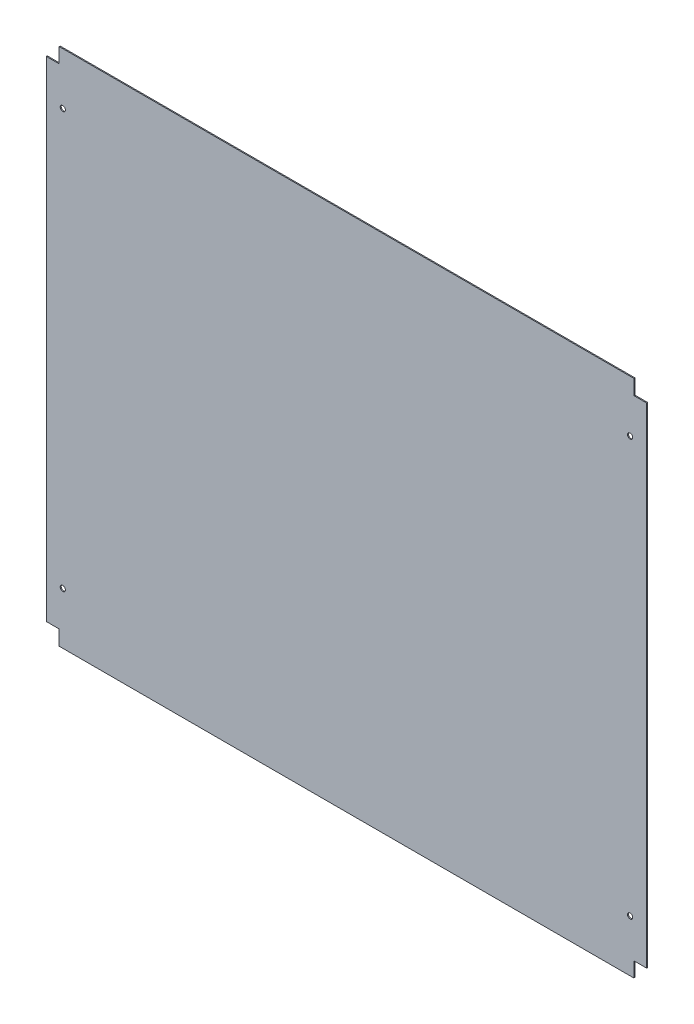
ISO-10303-21;
HEADER;
FILE_DESCRIPTION(('STEP AP214'),'2;1');
FILE_NAME('part.step','',(''),(''),'','','');
FILE_SCHEMA(('AUTOMOTIVE_DESIGN { 1 0 10303 214 1 1 1 1 }'));
ENDSEC;
DATA;
#1=APPLICATION_CONTEXT('core data for automotive mechanical design processes');
#2=APPLICATION_PROTOCOL_DEFINITION('international standard','automotive_design',2000,#1);
#3=PRODUCT_CONTEXT('',#1,'mechanical');
#4=PRODUCT('Part','Part','',(#3));
#5=PRODUCT_RELATED_PRODUCT_CATEGORY('part','',(#4));
#6=PRODUCT_DEFINITION_FORMATION('','',#4);
#7=PRODUCT_DEFINITION_CONTEXT('part definition',#1,'design');
#8=PRODUCT_DEFINITION('design','',#6,#7);
#9=PRODUCT_DEFINITION_SHAPE('','',#8);
#10=(LENGTH_UNIT() NAMED_UNIT(*) SI_UNIT(.MILLI.,.METRE.));
#11=(NAMED_UNIT(*) PLANE_ANGLE_UNIT() SI_UNIT($,.RADIAN.));
#12=(NAMED_UNIT(*) SI_UNIT($,.STERADIAN.) SOLID_ANGLE_UNIT());
#13=UNCERTAINTY_MEASURE_WITH_UNIT(LENGTH_MEASURE(1.E-05),#10,'distance_accuracy_value','');
#14=(GEOMETRIC_REPRESENTATION_CONTEXT(3) GLOBAL_UNCERTAINTY_ASSIGNED_CONTEXT((#13)) GLOBAL_UNIT_ASSIGNED_CONTEXT((#10,
#11,#12)) REPRESENTATION_CONTEXT('',''));
#15=CARTESIAN_POINT('',(0.,0.,0.));
#16=DIRECTION('',(0.,0.,1.));
#17=DIRECTION('',(1.,0.,0.));
#18=AXIS2_PLACEMENT_3D('',#15,#16,#17);
#19=CARTESIAN_POINT('',(442.087,-373.888,-19.05));
#20=DIRECTION('',(0.,1.,0.));
#21=DIRECTION('',(0.,0.,1.));
#22=AXIS2_PLACEMENT_3D('',#19,#20,#21);
#23=PLANE('',#22);
#24=DIRECTION('',(1.,0.,0.));
#25=VECTOR('',#24,1.);
#26=CARTESIAN_POINT('',(0.,-373.888,-1.524));
#27=LINE('',#26,#25);
#28=CARTESIAN_POINT('',(438.9628,-373.888,-1.524));
#29=VERTEX_POINT('',#28);
#30=CARTESIAN_POINT('',(458.583962531013,-373.888,-1.52399999999986));
#31=VERTEX_POINT('',#30);
#32=EDGE_CURVE('E351',#29,#31,#27,.T.);
#33=ORIENTED_EDGE('',*,*,#32,.T.);
#34=DIRECTION('',(0.,0.,-1.));
#35=VECTOR('',#34,1.);
#36=CARTESIAN_POINT('',(458.583962531013,-373.888,2.22044604925031E-13));
#37=LINE('',#36,#35);
#38=CARTESIAN_POINT('',(458.583962531013,-373.888,2.22044604925031E-13));
#39=VERTEX_POINT('',#38);
#40=EDGE_CURVE('E271',#39,#31,#37,.T.);
#41=ORIENTED_EDGE('',*,*,#40,.F.);
#42=DIRECTION('',(-1.,0.,0.));
#43=VECTOR('',#42,1.);
#44=CARTESIAN_POINT('',(442.087,-373.888,0.));
#45=LINE('',#44,#43);
#46=CARTESIAN_POINT('',(438.9628,-373.888,0.));
#47=VERTEX_POINT('',#46);
#48=EDGE_CURVE('E298',#39,#47,#45,.T.);
#49=ORIENTED_EDGE('',*,*,#48,.T.);
#50=DIRECTION('',(0.,0.,1.));
#51=VECTOR('',#50,1.);
#52=CARTESIAN_POINT('',(438.9628,-373.888,-19.05));
#53=LINE('',#52,#51);
#54=EDGE_CURVE('E324',#29,#47,#53,.T.);
#55=ORIENTED_EDGE('',*,*,#54,.F.);
#56=EDGE_LOOP('',(#33,#41,#49,#55));
#57=FACE_BOUND('',#56,.T.);
#58=ADVANCED_FACE('F136',(#57),#23,.F.);
#59=CARTESIAN_POINT('',(438.9628,-380.238,-19.05));
#60=DIRECTION('',(-1.,0.,0.));
#61=DIRECTION('',(0.,0.,1.));
#62=AXIS2_PLACEMENT_3D('',#59,#60,#61);
#63=PLANE('',#62);
#64=DIRECTION('',(0.,-1.,0.));
#65=VECTOR('',#64,1.);
#66=CARTESIAN_POINT('',(438.9628,-380.238,0.));
#67=LINE('',#66,#65);
#68=CARTESIAN_POINT('',(438.9628,-396.734962531013,1.11022302462516E-13));
#69=VERTEX_POINT('',#68);
#70=EDGE_CURVE('E333',#47,#69,#67,.T.);
#71=ORIENTED_EDGE('',*,*,#70,.T.);
#72=DIRECTION('',(0.,0.,1.));
#73=VECTOR('',#72,1.);
#74=CARTESIAN_POINT('',(438.9628,-396.734962531013,1.11022302462516E-13));
#75=LINE('',#74,#73);
#76=CARTESIAN_POINT('',(438.9628,-396.734962531013,-1.52399999999986));
#77=VERTEX_POINT('',#76);
#78=EDGE_CURVE('E260',#77,#69,#75,.T.);
#79=ORIENTED_EDGE('',*,*,#78,.F.);
#80=DIRECTION('',(0.,1.,0.));
#81=VECTOR('',#80,1.);
#82=CARTESIAN_POINT('',(438.9628,0.,-1.524));
#83=LINE('',#82,#81);
#84=EDGE_CURVE('E152',#77,#29,#83,.T.);
#85=ORIENTED_EDGE('',*,*,#84,.T.);
#86=ORIENTED_EDGE('',*,*,#54,.T.);
#87=EDGE_LOOP('',(#71,#79,#85,#86));
#88=FACE_BOUND('',#87,.T.);
#89=ADVANCED_FACE('F434',(#88),#63,.F.);
#90=CARTESIAN_POINT('',(438.9628,380.238,-19.05));
#91=DIRECTION('',(-1.,0.,0.));
#92=DIRECTION('',(0.,0.,1.));
#93=AXIS2_PLACEMENT_3D('',#90,#91,#92);
#94=PLANE('',#93);
#95=DIRECTION('',(0.,1.,0.));
#96=VECTOR('',#95,1.);
#97=CARTESIAN_POINT('',(438.9628,0.,-1.524));
#98=LINE('',#97,#96);
#99=CARTESIAN_POINT('',(438.9628,373.888,-1.524));
#100=VERTEX_POINT('',#99);
#101=CARTESIAN_POINT('',(438.9628,396.734962531012,-1.52399999999991));
#102=VERTEX_POINT('',#101);
#103=EDGE_CURVE('E242',#100,#102,#98,.T.);
#104=ORIENTED_EDGE('',*,*,#103,.T.);
#105=DIRECTION('',(0.,0.,-1.));
#106=VECTOR('',#105,1.);
#107=CARTESIAN_POINT('',(438.9628,396.734962531012,1.11022302462516E-13));
#108=LINE('',#107,#106);
#109=CARTESIAN_POINT('',(438.9628,396.734962531012,1.11022302462516E-13));
#110=VERTEX_POINT('',#109);
#111=EDGE_CURVE('E239',#110,#102,#108,.T.);
#112=ORIENTED_EDGE('',*,*,#111,.F.);
#113=DIRECTION('',(0.,-1.,0.));
#114=VECTOR('',#113,1.);
#115=CARTESIAN_POINT('',(438.9628,380.238,0.));
#116=LINE('',#115,#114);
#117=CARTESIAN_POINT('',(438.9628,373.888,0.));
#118=VERTEX_POINT('',#117);
#119=EDGE_CURVE('E227',#110,#118,#116,.T.);
#120=ORIENTED_EDGE('',*,*,#119,.T.);
#121=DIRECTION('',(0.,0.,1.));
#122=VECTOR('',#121,1.);
#123=CARTESIAN_POINT('',(438.9628,373.888,-19.05));
#124=LINE('',#123,#122);
#125=EDGE_CURVE('E340',#100,#118,#124,.T.);
#126=ORIENTED_EDGE('',*,*,#125,.F.);
#127=EDGE_LOOP('',(#104,#112,#120,#126));
#128=FACE_BOUND('',#127,.T.);
#129=ADVANCED_FACE('F240',(#128),#94,.F.);
#130=CARTESIAN_POINT('',(442.087,373.888,-19.05));
#131=DIRECTION('',(0.,-1.,0.));
#132=DIRECTION('',(1.,0.,0.));
#133=AXIS2_PLACEMENT_3D('',#130,#131,#132);
#134=PLANE('',#133);
#135=DIRECTION('',(1.,0.,0.));
#136=VECTOR('',#135,1.);
#137=CARTESIAN_POINT('',(442.087,373.888,0.));
#138=LINE('',#137,#136);
#139=CARTESIAN_POINT('',(458.583962531013,373.888,1.66533453693773E-13));
#140=VERTEX_POINT('',#139);
#141=EDGE_CURVE('E233',#118,#140,#138,.T.);
#142=ORIENTED_EDGE('',*,*,#141,.T.);
#143=DIRECTION('',(0.,0.,1.));
#144=VECTOR('',#143,1.);
#145=CARTESIAN_POINT('',(458.583962531013,373.888,0.));
#146=LINE('',#145,#144);
#147=CARTESIAN_POINT('',(458.583962531013,373.888,-1.52399999999986));
#148=VERTEX_POINT('',#147);
#149=EDGE_CURVE('E283',#148,#140,#146,.T.);
#150=ORIENTED_EDGE('',*,*,#149,.F.);
#151=DIRECTION('',(-1.,0.,0.));
#152=VECTOR('',#151,1.);
#153=CARTESIAN_POINT('',(1.32865714816934E-11,373.888000000016,-1.524));
#154=LINE('',#153,#152);
#155=EDGE_CURVE('E160',#148,#100,#154,.T.);
#156=ORIENTED_EDGE('',*,*,#155,.T.);
#157=ORIENTED_EDGE('',*,*,#125,.T.);
#158=EDGE_LOOP('',(#142,#150,#156,#157));
#159=FACE_BOUND('',#158,.T.);
#160=ADVANCED_FACE('F442',(#159),#134,.F.);
#161=CARTESIAN_POINT('',(-438.9628,-380.238,-19.05));
#162=DIRECTION('',(1.,0.,0.));
#163=DIRECTION('',(0.,0.,-1.));
#164=AXIS2_PLACEMENT_3D('',#161,#162,#163);
#165=PLANE('',#164);
#166=DIRECTION('',(0.,-1.,0.));
#167=VECTOR('',#166,1.);
#168=CARTESIAN_POINT('',(-438.9628,0.,-1.524));
#169=LINE('',#168,#167);
#170=CARTESIAN_POINT('',(-438.9628,-373.888,-1.524));
#171=VERTEX_POINT('',#170);
#172=CARTESIAN_POINT('',(-438.9628,-396.734962531013,-1.52399999999986));
#173=VERTEX_POINT('',#172);
#174=EDGE_CURVE('E354',#171,#173,#169,.T.);
#175=ORIENTED_EDGE('',*,*,#174,.T.);
#176=DIRECTION('',(0.,0.,-1.));
#177=VECTOR('',#176,1.);
#178=CARTESIAN_POINT('',(-438.9628,-396.734962531013,1.11022302462516E-13));
#179=LINE('',#178,#177);
#180=CARTESIAN_POINT('',(-438.9628,-396.734962531013,1.11022302462516E-13));
#181=VERTEX_POINT('',#180);
#182=EDGE_CURVE('E272',#181,#173,#179,.T.);
#183=ORIENTED_EDGE('',*,*,#182,.F.);
#184=DIRECTION('',(0.,1.,0.));
#185=VECTOR('',#184,1.);
#186=CARTESIAN_POINT('',(-438.9628,-380.238,0.));
#187=LINE('',#186,#185);
#188=CARTESIAN_POINT('',(-438.9628,-373.888,0.));
#189=VERTEX_POINT('',#188);
#190=EDGE_CURVE('E320',#181,#189,#187,.T.);
#191=ORIENTED_EDGE('',*,*,#190,.T.);
#192=DIRECTION('',(0.,0.,1.));
#193=VECTOR('',#192,1.);
#194=CARTESIAN_POINT('',(-438.9628,-373.888,-19.05));
#195=LINE('',#194,#193);
#196=EDGE_CURVE('E315',#171,#189,#195,.T.);
#197=ORIENTED_EDGE('',*,*,#196,.F.);
#198=EDGE_LOOP('',(#175,#183,#191,#197));
#199=FACE_BOUND('',#198,.T.);
#200=ADVANCED_FACE('F445',(#199),#165,.F.);
#201=CARTESIAN_POINT('',(-442.087,-373.888,-19.05));
#202=DIRECTION('',(0.,1.,0.));
#203=DIRECTION('',(0.,0.,1.));
#204=AXIS2_PLACEMENT_3D('',#201,#202,#203);
#205=PLANE('',#204);
#206=DIRECTION('',(-1.,0.,0.));
#207=VECTOR('',#206,1.);
#208=CARTESIAN_POINT('',(-442.087,-373.888,0.));
#209=LINE('',#208,#207);
#210=CARTESIAN_POINT('',(-458.583962531012,-373.888,1.66533453693773E-13));
#211=VERTEX_POINT('',#210);
#212=EDGE_CURVE('E323',#189,#211,#209,.T.);
#213=ORIENTED_EDGE('',*,*,#212,.T.);
#214=DIRECTION('',(0.,0.,1.));
#215=VECTOR('',#214,1.);
#216=CARTESIAN_POINT('',(-458.583962531012,-373.888,1.66533453693773E-13));
#217=LINE('',#216,#215);
#218=CARTESIAN_POINT('',(-458.583962531012,-373.888,-1.52399999999986));
#219=VERTEX_POINT('',#218);
#220=EDGE_CURVE('E303',#219,#211,#217,.T.);
#221=ORIENTED_EDGE('',*,*,#220,.F.);
#222=DIRECTION('',(1.,0.,0.));
#223=VECTOR('',#222,1.);
#224=CARTESIAN_POINT('',(0.,-373.888,-1.524));
#225=LINE('',#224,#223);
#226=EDGE_CURVE('E346',#219,#171,#225,.T.);
#227=ORIENTED_EDGE('',*,*,#226,.T.);
#228=ORIENTED_EDGE('',*,*,#196,.T.);
#229=EDGE_LOOP('',(#213,#221,#227,#228));
#230=FACE_BOUND('',#229,.T.);
#231=ADVANCED_FACE('F448',(#230),#205,.F.);
#232=CARTESIAN_POINT('',(-442.087,373.888,-19.05));
#233=DIRECTION('',(0.,-1.,0.));
#234=DIRECTION('',(1.,0.,0.));
#235=AXIS2_PLACEMENT_3D('',#232,#233,#234);
#236=PLANE('',#235);
#237=DIRECTION('',(-1.,0.,0.));
#238=VECTOR('',#237,1.);
#239=CARTESIAN_POINT('',(-1.32865714816934E-11,373.888000000015,-1.524));
#240=LINE('',#239,#238);
#241=CARTESIAN_POINT('',(-438.9628,373.888,-1.524));
#242=VERTEX_POINT('',#241);
#243=CARTESIAN_POINT('',(-458.583962531012,373.888,-1.52399999999986));
#244=VERTEX_POINT('',#243);
#245=EDGE_CURVE('E343',#242,#244,#240,.T.);
#246=ORIENTED_EDGE('',*,*,#245,.T.);
#247=DIRECTION('',(0.,0.,-1.));
#248=VECTOR('',#247,1.);
#249=CARTESIAN_POINT('',(-458.583962531012,373.888,1.11022302462516E-13));
#250=LINE('',#249,#248);
#251=CARTESIAN_POINT('',(-458.583962531012,373.888,1.11022302462516E-13));
#252=VERTEX_POINT('',#251);
#253=EDGE_CURVE('E299',#252,#244,#250,.T.);
#254=ORIENTED_EDGE('',*,*,#253,.F.);
#255=DIRECTION('',(1.,0.,0.));
#256=VECTOR('',#255,1.);
#257=CARTESIAN_POINT('',(-442.087,373.888,0.));
#258=LINE('',#257,#256);
#259=CARTESIAN_POINT('',(-438.9628,373.888,0.));
#260=VERTEX_POINT('',#259);
#261=EDGE_CURVE('E310',#252,#260,#258,.T.);
#262=ORIENTED_EDGE('',*,*,#261,.T.);
#263=DIRECTION('',(0.,0.,1.));
#264=VECTOR('',#263,1.);
#265=CARTESIAN_POINT('',(-438.9628,373.888,-19.05));
#266=LINE('',#265,#264);
#267=EDGE_CURVE('E236',#242,#260,#266,.T.);
#268=ORIENTED_EDGE('',*,*,#267,.F.);
#269=EDGE_LOOP('',(#246,#254,#262,#268));
#270=FACE_BOUND('',#269,.T.);
#271=ADVANCED_FACE('F452',(#270),#236,.F.);
#272=CARTESIAN_POINT('',(-438.9628,380.238,-19.05));
#273=DIRECTION('',(1.,0.,0.));
#274=DIRECTION('',(0.,0.,-1.));
#275=AXIS2_PLACEMENT_3D('',#272,#273,#274);
#276=PLANE('',#275);
#277=DIRECTION('',(0.,1.,0.));
#278=VECTOR('',#277,1.);
#279=CARTESIAN_POINT('',(-438.9628,380.238,0.));
#280=LINE('',#279,#278);
#281=CARTESIAN_POINT('',(-438.9628,396.734962531012,0.));
#282=VERTEX_POINT('',#281);
#283=EDGE_CURVE('E314',#260,#282,#280,.T.);
#284=ORIENTED_EDGE('',*,*,#283,.T.);
#285=DIRECTION('',(0.,0.,1.));
#286=VECTOR('',#285,1.);
#287=CARTESIAN_POINT('',(-438.9628,396.734962531012,0.));
#288=LINE('',#287,#286);
#289=CARTESIAN_POINT('',(-438.9628,396.734962531012,-1.52399999999991));
#290=VERTEX_POINT('',#289);
#291=EDGE_CURVE('E247',#290,#282,#288,.T.);
#292=ORIENTED_EDGE('',*,*,#291,.F.);
#293=DIRECTION('',(0.,-1.,0.));
#294=VECTOR('',#293,1.);
#295=CARTESIAN_POINT('',(-438.9628,0.,-1.524));
#296=LINE('',#295,#294);
#297=EDGE_CURVE('E361',#290,#242,#296,.T.);
#298=ORIENTED_EDGE('',*,*,#297,.T.);
#299=ORIENTED_EDGE('',*,*,#267,.T.);
#300=EDGE_LOOP('',(#284,#292,#298,#299));
#301=FACE_BOUND('',#300,.T.);
#302=ADVANCED_FACE('F450',(#301),#276,.F.);
#303=CARTESIAN_POINT('',(0.,0.,-1.524));
#304=DIRECTION('',(0.,0.,-1.));
#305=DIRECTION('',(-1.,0.,0.));
#306=AXIS2_PLACEMENT_3D('',#303,#304,#305);
#307=PLANE('',#306);
#308=ORIENTED_EDGE('',*,*,#84,.F.);
#309=DIRECTION('',(-1.,0.,0.));
#310=VECTOR('',#309,1.);
#311=CARTESIAN_POINT('',(442.087,-396.734962531013,-1.52399999999986));
#312=LINE('',#311,#310);
#313=EDGE_CURVE('E253',#173,#77,#312,.F.);
#314=ORIENTED_EDGE('',*,*,#313,.F.);
#315=ORIENTED_EDGE('',*,*,#174,.F.);
#316=ORIENTED_EDGE('',*,*,#226,.F.);
#317=DIRECTION('',(0.,1.,0.));
#318=VECTOR('',#317,1.);
#319=CARTESIAN_POINT('',(-458.583962531012,-380.238,-1.52399999999986));
#320=LINE('',#319,#318);
#321=EDGE_CURVE('E282',#244,#219,#320,.F.);
#322=ORIENTED_EDGE('',*,*,#321,.F.);
#323=ORIENTED_EDGE('',*,*,#245,.F.);
#324=ORIENTED_EDGE('',*,*,#297,.F.);
#325=DIRECTION('',(1.,0.,0.));
#326=VECTOR('',#325,1.);
#327=CARTESIAN_POINT('',(-442.087,396.734962531012,-1.52399999999991));
#328=LINE('',#327,#326);
#329=EDGE_CURVE('E265',#102,#290,#328,.F.);
#330=ORIENTED_EDGE('',*,*,#329,.F.);
#331=ORIENTED_EDGE('',*,*,#103,.F.);
#332=ORIENTED_EDGE('',*,*,#155,.F.);
#333=DIRECTION('',(0.,-1.,0.));
#334=VECTOR('',#333,1.);
#335=CARTESIAN_POINT('',(458.583962531013,380.238,-1.52399999999986));
#336=LINE('',#335,#334);
#337=EDGE_CURVE('E287',#31,#148,#336,.F.);
#338=ORIENTED_EDGE('',*,*,#337,.F.);
#339=ORIENTED_EDGE('',*,*,#32,.F.);
#340=EDGE_LOOP('',(#308,#314,#315,#316,#322,#323,#324,#330,#331,#332,#338,#339));
#341=FACE_BOUND('',#340,.T.);
#342=CARTESIAN_POINT('',(433.324,317.5,-1.524));
#343=DIRECTION('',(0.,0.,1.));
#344=DIRECTION('',(1.,0.,0.));
#345=AXIS2_PLACEMENT_3D('',#342,#343,#344);
#346=CIRCLE('',#345,3.9624);
#347=CARTESIAN_POINT('',(437.2864,317.5,-1.524));
#348=VERTEX_POINT('',#347);
#349=EDGE_CURVE('E365',#348,#348,#346,.T.);
#350=ORIENTED_EDGE('',*,*,#349,.T.);
#351=EDGE_LOOP('',(#350));
#352=FACE_BOUND('',#351,.T.);
#353=CARTESIAN_POINT('',(433.324,-317.5,-1.524));
#354=DIRECTION('',(0.,0.,1.));
#355=DIRECTION('',(1.,0.,0.));
#356=AXIS2_PLACEMENT_3D('',#353,#354,#355);
#357=CIRCLE('',#356,3.9624);
#358=CARTESIAN_POINT('',(437.2864,-317.5,-1.524));
#359=VERTEX_POINT('',#358);
#360=EDGE_CURVE('E372',#359,#359,#357,.T.);
#361=ORIENTED_EDGE('',*,*,#360,.T.);
#362=EDGE_LOOP('',(#361));
#363=FACE_BOUND('',#362,.T.);
#364=CARTESIAN_POINT('',(-433.451,-317.5,-1.524));
#365=DIRECTION('',(0.,0.,1.));
#366=DIRECTION('',(1.,0.,0.));
#367=AXIS2_PLACEMENT_3D('',#364,#365,#366);
#368=CIRCLE('',#367,3.9624);
#369=CARTESIAN_POINT('',(-429.4886,-317.5,-1.524));
#370=VERTEX_POINT('',#369);
#371=EDGE_CURVE('E380',#370,#370,#368,.T.);
#372=ORIENTED_EDGE('',*,*,#371,.T.);
#373=EDGE_LOOP('',(#372));
#374=FACE_BOUND('',#373,.T.);
#375=CARTESIAN_POINT('',(-433.451,317.5,-1.524));
#376=DIRECTION('',(0.,0.,1.));
#377=DIRECTION('',(1.,0.,0.));
#378=AXIS2_PLACEMENT_3D('',#375,#376,#377);
#379=CIRCLE('',#378,3.9624);
#380=CARTESIAN_POINT('',(-429.4886,317.5,-1.524));
#381=VERTEX_POINT('',#380);
#382=EDGE_CURVE('E13',#381,#381,#379,.T.);
#383=ORIENTED_EDGE('',*,*,#382,.T.);
#384=EDGE_LOOP('',(#383));
#385=FACE_BOUND('',#384,.T.);
#386=ADVANCED_FACE('F394',(#341,#352,#363,#374,#385),#307,.T.);
#387=CARTESIAN_POINT('',(0.,0.,0.));
#388=DIRECTION('',(0.,0.,-1.));
#389=DIRECTION('',(-1.,0.,0.));
#390=AXIS2_PLACEMENT_3D('',#387,#388,#389);
#391=PLANE('',#390);
#392=CARTESIAN_POINT('',(433.324,317.5,0.));
#393=DIRECTION('',(0.,0.,1.));
#394=DIRECTION('',(1.,0.,0.));
#395=AXIS2_PLACEMENT_3D('',#392,#393,#394);
#396=CIRCLE('',#395,3.9624);
#397=CARTESIAN_POINT('',(437.2864,317.5,0.));
#398=VERTEX_POINT('',#397);
#399=EDGE_CURVE('E364',#398,#398,#396,.T.);
#400=ORIENTED_EDGE('',*,*,#399,.F.);
#401=EDGE_LOOP('',(#400));
#402=FACE_BOUND('',#401,.T.);
#403=CARTESIAN_POINT('',(433.324,-317.5,0.));
#404=DIRECTION('',(0.,0.,1.));
#405=DIRECTION('',(1.,0.,0.));
#406=AXIS2_PLACEMENT_3D('',#403,#404,#405);
#407=CIRCLE('',#406,3.9624);
#408=CARTESIAN_POINT('',(437.2864,-317.5,0.));
#409=VERTEX_POINT('',#408);
#410=EDGE_CURVE('E369',#409,#409,#407,.T.);
#411=ORIENTED_EDGE('',*,*,#410,.F.);
#412=EDGE_LOOP('',(#411));
#413=FACE_BOUND('',#412,.T.);
#414=CARTESIAN_POINT('',(-433.451,-317.5,0.));
#415=DIRECTION('',(0.,0.,1.));
#416=DIRECTION('',(1.,0.,0.));
#417=AXIS2_PLACEMENT_3D('',#414,#415,#416);
#418=CIRCLE('',#417,3.9624);
#419=CARTESIAN_POINT('',(-429.4886,-317.5,0.));
#420=VERTEX_POINT('',#419);
#421=EDGE_CURVE('E376',#420,#420,#418,.T.);
#422=ORIENTED_EDGE('',*,*,#421,.F.);
#423=EDGE_LOOP('',(#422));
#424=FACE_BOUND('',#423,.T.);
#425=CARTESIAN_POINT('',(-433.451,317.5,0.));
#426=DIRECTION('',(0.,0.,1.));
#427=DIRECTION('',(1.,0.,0.));
#428=AXIS2_PLACEMENT_3D('',#425,#426,#427);
#429=CIRCLE('',#428,3.9624);
#430=CARTESIAN_POINT('',(-429.4886,317.5,0.));
#431=VERTEX_POINT('',#430);
#432=EDGE_CURVE('E140',#431,#431,#429,.T.);
#433=ORIENTED_EDGE('',*,*,#432,.F.);
#434=EDGE_LOOP('',(#433));
#435=FACE_BOUND('',#434,.T.);
#436=ORIENTED_EDGE('',*,*,#190,.F.);
#437=DIRECTION('',(1.,0.,0.));
#438=VECTOR('',#437,1.);
#439=CARTESIAN_POINT('',(0.,-396.734962531013,1.66533453693773E-13));
#440=LINE('',#439,#438);
#441=EDGE_CURVE('E268',#181,#69,#440,.T.);
#442=ORIENTED_EDGE('',*,*,#441,.T.);
#443=ORIENTED_EDGE('',*,*,#70,.F.);
#444=ORIENTED_EDGE('',*,*,#48,.F.);
#445=DIRECTION('',(0.,1.,0.));
#446=VECTOR('',#445,1.);
#447=CARTESIAN_POINT('',(458.583962531013,0.,1.66533453693773E-13));
#448=LINE('',#447,#446);
#449=EDGE_CURVE('E279',#39,#140,#448,.T.);
#450=ORIENTED_EDGE('',*,*,#449,.T.);
#451=ORIENTED_EDGE('',*,*,#141,.F.);
#452=ORIENTED_EDGE('',*,*,#119,.F.);
#453=DIRECTION('',(-1.,0.,0.));
#454=VECTOR('',#453,1.);
#455=CARTESIAN_POINT('',(0.,396.734962531012,1.11022302462516E-13));
#456=LINE('',#455,#454);
#457=EDGE_CURVE('E231',#110,#282,#456,.T.);
#458=ORIENTED_EDGE('',*,*,#457,.T.);
#459=ORIENTED_EDGE('',*,*,#283,.F.);
#460=ORIENTED_EDGE('',*,*,#261,.F.);
#461=DIRECTION('',(0.,-1.,0.));
#462=VECTOR('',#461,1.);
#463=CARTESIAN_POINT('',(-458.583962531012,0.,1.66533453693773E-13));
#464=LINE('',#463,#462);
#465=EDGE_CURVE('E294',#252,#211,#464,.T.);
#466=ORIENTED_EDGE('',*,*,#465,.T.);
#467=ORIENTED_EDGE('',*,*,#212,.F.);
#468=EDGE_LOOP('',(#436,#442,#443,#444,#450,#451,#452,#458,#459,#460,#466,#467));
#469=FACE_BOUND('',#468,.T.);
#470=ADVANCED_FACE('F138',(#402,#413,#424,#435,#469),#391,.F.);
#471=CARTESIAN_POINT('',(-433.451,317.5,-1.524));
#472=DIRECTION('',(0.,0.,1.));
#473=DIRECTION('',(1.,0.,0.));
#474=AXIS2_PLACEMENT_3D('',#471,#472,#473);
#475=CYLINDRICAL_SURFACE('',#474,3.9624);
#476=CARTESIAN_POINT('',(-429.4886,317.5,-1.524));
#477=CARTESIAN_POINT('',(-429.4886,317.5,-1.508125));
#478=CARTESIAN_POINT('',(-429.4886,317.5,-1.49225));
#479=CARTESIAN_POINT('',(-429.4886,317.5,-1.4605));
#480=CARTESIAN_POINT('',(-429.4886,317.5,-1.444625));
#481=CARTESIAN_POINT('',(-429.4886,317.5,-1.412875));
#482=CARTESIAN_POINT('',(-429.4886,317.5,-1.397));
#483=CARTESIAN_POINT('',(-429.4886,317.5,-1.36525));
#484=CARTESIAN_POINT('',(-429.4886,317.5,-1.349375));
#485=CARTESIAN_POINT('',(-429.4886,317.5,-1.317625));
#486=CARTESIAN_POINT('',(-429.4886,317.5,-1.30175));
#487=CARTESIAN_POINT('',(-429.4886,317.5,-1.27));
#488=CARTESIAN_POINT('',(-429.4886,317.5,-1.254125));
#489=CARTESIAN_POINT('',(-429.4886,317.5,-1.222375));
#490=CARTESIAN_POINT('',(-429.4886,317.5,-1.2065));
#491=CARTESIAN_POINT('',(-429.4886,317.5,-1.17475));
#492=CARTESIAN_POINT('',(-429.4886,317.5,-1.158875));
#493=CARTESIAN_POINT('',(-429.4886,317.5,-1.127125));
#494=CARTESIAN_POINT('',(-429.4886,317.5,-1.11125));
#495=CARTESIAN_POINT('',(-429.4886,317.5,-1.0795));
#496=CARTESIAN_POINT('',(-429.4886,317.5,-1.063625));
#497=CARTESIAN_POINT('',(-429.4886,317.5,-1.031875));
#498=CARTESIAN_POINT('',(-429.4886,317.5,-1.016));
#499=CARTESIAN_POINT('',(-429.4886,317.5,-0.98425));
#500=CARTESIAN_POINT('',(-429.4886,317.5,-0.968375));
#501=CARTESIAN_POINT('',(-429.4886,317.5,-0.936625));
#502=CARTESIAN_POINT('',(-429.4886,317.5,-0.92075));
#503=CARTESIAN_POINT('',(-429.4886,317.5,-0.889));
#504=CARTESIAN_POINT('',(-429.4886,317.5,-0.873125));
#505=CARTESIAN_POINT('',(-429.4886,317.5,-0.841375));
#506=CARTESIAN_POINT('',(-429.4886,317.5,-0.8255));
#507=CARTESIAN_POINT('',(-429.4886,317.5,-0.79375));
#508=CARTESIAN_POINT('',(-429.4886,317.5,-0.777875));
#509=CARTESIAN_POINT('',(-429.4886,317.5,-0.746125));
#510=CARTESIAN_POINT('',(-429.4886,317.5,-0.73025));
#511=CARTESIAN_POINT('',(-429.4886,317.5,-0.6985));
#512=CARTESIAN_POINT('',(-429.4886,317.5,-0.682625));
#513=CARTESIAN_POINT('',(-429.4886,317.5,-0.650875));
#514=CARTESIAN_POINT('',(-429.4886,317.5,-0.635));
#515=CARTESIAN_POINT('',(-429.4886,317.5,-0.60325));
#516=CARTESIAN_POINT('',(-429.4886,317.5,-0.587375));
#517=CARTESIAN_POINT('',(-429.4886,317.5,-0.555625));
#518=CARTESIAN_POINT('',(-429.4886,317.5,-0.53975));
#519=CARTESIAN_POINT('',(-429.4886,317.5,-0.508));
#520=CARTESIAN_POINT('',(-429.4886,317.5,-0.492125));
#521=CARTESIAN_POINT('',(-429.4886,317.5,-0.460375));
#522=CARTESIAN_POINT('',(-429.4886,317.5,-0.4445));
#523=CARTESIAN_POINT('',(-429.4886,317.5,-0.41275));
#524=CARTESIAN_POINT('',(-429.4886,317.5,-0.396875));
#525=CARTESIAN_POINT('',(-429.4886,317.5,-0.365125));
#526=CARTESIAN_POINT('',(-429.4886,317.5,-0.34925));
#527=CARTESIAN_POINT('',(-429.4886,317.5,-0.3175));
#528=CARTESIAN_POINT('',(-429.4886,317.5,-0.301625));
#529=CARTESIAN_POINT('',(-429.4886,317.5,-0.269875));
#530=CARTESIAN_POINT('',(-429.4886,317.5,-0.254));
#531=CARTESIAN_POINT('',(-429.4886,317.5,-0.22225));
#532=CARTESIAN_POINT('',(-429.4886,317.5,-0.206375));
#533=CARTESIAN_POINT('',(-429.4886,317.5,-0.174625));
#534=CARTESIAN_POINT('',(-429.4886,317.5,-0.15875));
#535=CARTESIAN_POINT('',(-429.4886,317.5,-0.127));
#536=CARTESIAN_POINT('',(-429.4886,317.5,-0.111125));
#537=CARTESIAN_POINT('',(-429.4886,317.5,-0.079375));
#538=CARTESIAN_POINT('',(-429.4886,317.5,-0.0635));
#539=CARTESIAN_POINT('',(-429.4886,317.5,-0.0317499999999999));
#540=CARTESIAN_POINT('',(-429.4886,317.5,-0.015875));
#541=CARTESIAN_POINT('',(-429.4886,317.5,0.));
#542=B_SPLINE_CURVE_WITH_KNOTS('',3,(#476,#477,#478,#479,#480,#481,#482,#483,#484,#485,#486,
#487,#488,#489,#490,#491,#492,#493,#494,#495,#496,#497,#498,#499,#500,#501,#502,#503,#504,#505,
#506,#507,#508,#509,#510,#511,#512,#513,#514,#515,#516,#517,#518,#519,#520,#521,#522,#523,#524,
#525,#526,#527,#528,#529,#530,#531,#532,#533,#534,#535,#536,#537,#538,#539,#540,#541),
.UNSPECIFIED.,.F.,.F.,(4,2,2,2,2,2,2,2,2,2,2,2,2,2,2,2,2,2,2,2,2,2,2,2,2,2,2,2,2,2,2,2,4),(0.,
0.0476249999999999,0.0952499999999998,0.142875,0.1905,0.238125,0.28575,0.333375,0.381,0.428625,
0.47625,0.523875,0.5715,0.619125,0.66675,0.714375,0.762,0.809625,0.85725,0.904875,0.9525,
1.000125,1.04775,1.095375,1.143,1.190625,1.23825,1.285875,1.3335,1.381125,1.42875,1.476375,
1.524),.UNSPECIFIED.);
#543=EDGE_CURVE('BSEAM393',#381,#431,#542,.T.);
#544=ORIENTED_EDGE('',*,*,#382,.F.);
#545=ORIENTED_EDGE('',*,*,#432,.T.);
#546=ORIENTED_EDGE('',*,*,#543,.T.);
#547=ORIENTED_EDGE('',*,*,#543,.F.);
#548=EDGE_LOOP('',(#544,#546,#545,#547));
#549=FACE_BOUND('',#548,.T.);
#550=ADVANCED_FACE('F393',(#549),#475,.F.);
#551=CARTESIAN_POINT('',(-433.451,-317.5,-1.524));
#552=DIRECTION('',(0.,0.,1.));
#553=DIRECTION('',(1.,0.,0.));
#554=AXIS2_PLACEMENT_3D('',#551,#552,#553);
#555=CYLINDRICAL_SURFACE('',#554,3.9624);
#556=CARTESIAN_POINT('',(-429.4886,-317.5,-1.524));
#557=CARTESIAN_POINT('',(-429.4886,-317.5,-1.508125));
#558=CARTESIAN_POINT('',(-429.4886,-317.5,-1.49225));
#559=CARTESIAN_POINT('',(-429.4886,-317.5,-1.4605));
#560=CARTESIAN_POINT('',(-429.4886,-317.5,-1.444625));
#561=CARTESIAN_POINT('',(-429.4886,-317.5,-1.412875));
#562=CARTESIAN_POINT('',(-429.4886,-317.5,-1.397));
#563=CARTESIAN_POINT('',(-429.4886,-317.5,-1.36525));
#564=CARTESIAN_POINT('',(-429.4886,-317.5,-1.349375));
#565=CARTESIAN_POINT('',(-429.4886,-317.5,-1.317625));
#566=CARTESIAN_POINT('',(-429.4886,-317.5,-1.30175));
#567=CARTESIAN_POINT('',(-429.4886,-317.5,-1.27));
#568=CARTESIAN_POINT('',(-429.4886,-317.5,-1.254125));
#569=CARTESIAN_POINT('',(-429.4886,-317.5,-1.222375));
#570=CARTESIAN_POINT('',(-429.4886,-317.5,-1.2065));
#571=CARTESIAN_POINT('',(-429.4886,-317.5,-1.17475));
#572=CARTESIAN_POINT('',(-429.4886,-317.5,-1.158875));
#573=CARTESIAN_POINT('',(-429.4886,-317.5,-1.127125));
#574=CARTESIAN_POINT('',(-429.4886,-317.5,-1.11125));
#575=CARTESIAN_POINT('',(-429.4886,-317.5,-1.0795));
#576=CARTESIAN_POINT('',(-429.4886,-317.5,-1.063625));
#577=CARTESIAN_POINT('',(-429.4886,-317.5,-1.031875));
#578=CARTESIAN_POINT('',(-429.4886,-317.5,-1.016));
#579=CARTESIAN_POINT('',(-429.4886,-317.5,-0.98425));
#580=CARTESIAN_POINT('',(-429.4886,-317.5,-0.968375));
#581=CARTESIAN_POINT('',(-429.4886,-317.5,-0.936625));
#582=CARTESIAN_POINT('',(-429.4886,-317.5,-0.92075));
#583=CARTESIAN_POINT('',(-429.4886,-317.5,-0.889));
#584=CARTESIAN_POINT('',(-429.4886,-317.5,-0.873125));
#585=CARTESIAN_POINT('',(-429.4886,-317.5,-0.841375));
#586=CARTESIAN_POINT('',(-429.4886,-317.5,-0.8255));
#587=CARTESIAN_POINT('',(-429.4886,-317.5,-0.79375));
#588=CARTESIAN_POINT('',(-429.4886,-317.5,-0.777875));
#589=CARTESIAN_POINT('',(-429.4886,-317.5,-0.746125));
#590=CARTESIAN_POINT('',(-429.4886,-317.5,-0.73025));
#591=CARTESIAN_POINT('',(-429.4886,-317.5,-0.6985));
#592=CARTESIAN_POINT('',(-429.4886,-317.5,-0.682625));
#593=CARTESIAN_POINT('',(-429.4886,-317.5,-0.650875));
#594=CARTESIAN_POINT('',(-429.4886,-317.5,-0.635));
#595=CARTESIAN_POINT('',(-429.4886,-317.5,-0.60325));
#596=CARTESIAN_POINT('',(-429.4886,-317.5,-0.587375));
#597=CARTESIAN_POINT('',(-429.4886,-317.5,-0.555625));
#598=CARTESIAN_POINT('',(-429.4886,-317.5,-0.53975));
#599=CARTESIAN_POINT('',(-429.4886,-317.5,-0.508));
#600=CARTESIAN_POINT('',(-429.4886,-317.5,-0.492125));
#601=CARTESIAN_POINT('',(-429.4886,-317.5,-0.460375));
#602=CARTESIAN_POINT('',(-429.4886,-317.5,-0.4445));
#603=CARTESIAN_POINT('',(-429.4886,-317.5,-0.41275));
#604=CARTESIAN_POINT('',(-429.4886,-317.5,-0.396875));
#605=CARTESIAN_POINT('',(-429.4886,-317.5,-0.365125));
#606=CARTESIAN_POINT('',(-429.4886,-317.5,-0.34925));
#607=CARTESIAN_POINT('',(-429.4886,-317.5,-0.3175));
#608=CARTESIAN_POINT('',(-429.4886,-317.5,-0.301625));
#609=CARTESIAN_POINT('',(-429.4886,-317.5,-0.269875));
#610=CARTESIAN_POINT('',(-429.4886,-317.5,-0.254));
#611=CARTESIAN_POINT('',(-429.4886,-317.5,-0.22225));
#612=CARTESIAN_POINT('',(-429.4886,-317.5,-0.206375));
#613=CARTESIAN_POINT('',(-429.4886,-317.5,-0.174625));
#614=CARTESIAN_POINT('',(-429.4886,-317.5,-0.15875));
#615=CARTESIAN_POINT('',(-429.4886,-317.5,-0.127));
#616=CARTESIAN_POINT('',(-429.4886,-317.5,-0.111125));
#617=CARTESIAN_POINT('',(-429.4886,-317.5,-0.079375));
#618=CARTESIAN_POINT('',(-429.4886,-317.5,-0.0635));
#619=CARTESIAN_POINT('',(-429.4886,-317.5,-0.0317499999999999));
#620=CARTESIAN_POINT('',(-429.4886,-317.5,-0.015875));
#621=CARTESIAN_POINT('',(-429.4886,-317.5,0.));
#622=B_SPLINE_CURVE_WITH_KNOTS('',3,(#556,#557,#558,#559,#560,#561,#562,#563,#564,#565,#566,
#567,#568,#569,#570,#571,#572,#573,#574,#575,#576,#577,#578,#579,#580,#581,#582,#583,#584,#585,
#586,#587,#588,#589,#590,#591,#592,#593,#594,#595,#596,#597,#598,#599,#600,#601,#602,#603,#604,
#605,#606,#607,#608,#609,#610,#611,#612,#613,#614,#615,#616,#617,#618,#619,#620,#621),
.UNSPECIFIED.,.F.,.F.,(4,2,2,2,2,2,2,2,2,2,2,2,2,2,2,2,2,2,2,2,2,2,2,2,2,2,2,2,2,2,2,2,4),(0.,
0.0476249999999999,0.0952499999999998,0.142875,0.1905,0.238125,0.28575,0.333375,0.381,0.428625,
0.47625,0.523875,0.5715,0.619125,0.66675,0.714375,0.762,0.809625,0.85725,0.904875,0.9525,
1.000125,1.04775,1.095375,1.143,1.190625,1.23825,1.285875,1.3335,1.381125,1.42875,1.476375,
1.524),.UNSPECIFIED.);
#623=EDGE_CURVE('BSEAM389',#370,#420,#622,.T.);
#624=ORIENTED_EDGE('',*,*,#371,.F.);
#625=ORIENTED_EDGE('',*,*,#421,.T.);
#626=ORIENTED_EDGE('',*,*,#623,.T.);
#627=ORIENTED_EDGE('',*,*,#623,.F.);
#628=EDGE_LOOP('',(#624,#626,#625,#627));
#629=FACE_BOUND('',#628,.T.);
#630=ADVANCED_FACE('F389',(#629),#555,.F.);
#631=CARTESIAN_POINT('',(433.324,-317.5,-1.524));
#632=DIRECTION('',(0.,0.,1.));
#633=DIRECTION('',(1.,0.,0.));
#634=AXIS2_PLACEMENT_3D('',#631,#632,#633);
#635=CYLINDRICAL_SURFACE('',#634,3.9624);
#636=CARTESIAN_POINT('',(437.2864,-317.5,-1.524));
#637=CARTESIAN_POINT('',(437.2864,-317.5,-1.508125));
#638=CARTESIAN_POINT('',(437.2864,-317.5,-1.49225));
#639=CARTESIAN_POINT('',(437.2864,-317.5,-1.4605));
#640=CARTESIAN_POINT('',(437.2864,-317.5,-1.444625));
#641=CARTESIAN_POINT('',(437.2864,-317.5,-1.412875));
#642=CARTESIAN_POINT('',(437.2864,-317.5,-1.397));
#643=CARTESIAN_POINT('',(437.2864,-317.5,-1.36525));
#644=CARTESIAN_POINT('',(437.2864,-317.5,-1.349375));
#645=CARTESIAN_POINT('',(437.2864,-317.5,-1.317625));
#646=CARTESIAN_POINT('',(437.2864,-317.5,-1.30175));
#647=CARTESIAN_POINT('',(437.2864,-317.5,-1.27));
#648=CARTESIAN_POINT('',(437.2864,-317.5,-1.254125));
#649=CARTESIAN_POINT('',(437.2864,-317.5,-1.222375));
#650=CARTESIAN_POINT('',(437.2864,-317.5,-1.2065));
#651=CARTESIAN_POINT('',(437.2864,-317.5,-1.17475));
#652=CARTESIAN_POINT('',(437.2864,-317.5,-1.158875));
#653=CARTESIAN_POINT('',(437.2864,-317.5,-1.127125));
#654=CARTESIAN_POINT('',(437.2864,-317.5,-1.11125));
#655=CARTESIAN_POINT('',(437.2864,-317.5,-1.0795));
#656=CARTESIAN_POINT('',(437.2864,-317.5,-1.063625));
#657=CARTESIAN_POINT('',(437.2864,-317.5,-1.031875));
#658=CARTESIAN_POINT('',(437.2864,-317.5,-1.016));
#659=CARTESIAN_POINT('',(437.2864,-317.5,-0.98425));
#660=CARTESIAN_POINT('',(437.2864,-317.5,-0.968375));
#661=CARTESIAN_POINT('',(437.2864,-317.5,-0.936625));
#662=CARTESIAN_POINT('',(437.2864,-317.5,-0.92075));
#663=CARTESIAN_POINT('',(437.2864,-317.5,-0.889));
#664=CARTESIAN_POINT('',(437.2864,-317.5,-0.873125));
#665=CARTESIAN_POINT('',(437.2864,-317.5,-0.841375));
#666=CARTESIAN_POINT('',(437.2864,-317.5,-0.8255));
#667=CARTESIAN_POINT('',(437.2864,-317.5,-0.79375));
#668=CARTESIAN_POINT('',(437.2864,-317.5,-0.777875));
#669=CARTESIAN_POINT('',(437.2864,-317.5,-0.746125));
#670=CARTESIAN_POINT('',(437.2864,-317.5,-0.73025));
#671=CARTESIAN_POINT('',(437.2864,-317.5,-0.6985));
#672=CARTESIAN_POINT('',(437.2864,-317.5,-0.682625));
#673=CARTESIAN_POINT('',(437.2864,-317.5,-0.650875));
#674=CARTESIAN_POINT('',(437.2864,-317.5,-0.635));
#675=CARTESIAN_POINT('',(437.2864,-317.5,-0.60325));
#676=CARTESIAN_POINT('',(437.2864,-317.5,-0.587375));
#677=CARTESIAN_POINT('',(437.2864,-317.5,-0.555625));
#678=CARTESIAN_POINT('',(437.2864,-317.5,-0.53975));
#679=CARTESIAN_POINT('',(437.2864,-317.5,-0.508));
#680=CARTESIAN_POINT('',(437.2864,-317.5,-0.492125));
#681=CARTESIAN_POINT('',(437.2864,-317.5,-0.460375));
#682=CARTESIAN_POINT('',(437.2864,-317.5,-0.4445));
#683=CARTESIAN_POINT('',(437.2864,-317.5,-0.41275));
#684=CARTESIAN_POINT('',(437.2864,-317.5,-0.396875));
#685=CARTESIAN_POINT('',(437.2864,-317.5,-0.365125));
#686=CARTESIAN_POINT('',(437.2864,-317.5,-0.34925));
#687=CARTESIAN_POINT('',(437.2864,-317.5,-0.3175));
#688=CARTESIAN_POINT('',(437.2864,-317.5,-0.301625));
#689=CARTESIAN_POINT('',(437.2864,-317.5,-0.269875));
#690=CARTESIAN_POINT('',(437.2864,-317.5,-0.254));
#691=CARTESIAN_POINT('',(437.2864,-317.5,-0.22225));
#692=CARTESIAN_POINT('',(437.2864,-317.5,-0.206375));
#693=CARTESIAN_POINT('',(437.2864,-317.5,-0.174625));
#694=CARTESIAN_POINT('',(437.2864,-317.5,-0.15875));
#695=CARTESIAN_POINT('',(437.2864,-317.5,-0.127));
#696=CARTESIAN_POINT('',(437.2864,-317.5,-0.111125));
#697=CARTESIAN_POINT('',(437.2864,-317.5,-0.079375));
#698=CARTESIAN_POINT('',(437.2864,-317.5,-0.0635));
#699=CARTESIAN_POINT('',(437.2864,-317.5,-0.0317499999999999));
#700=CARTESIAN_POINT('',(437.2864,-317.5,-0.015875));
#701=CARTESIAN_POINT('',(437.2864,-317.5,0.));
#702=B_SPLINE_CURVE_WITH_KNOTS('',3,(#636,#637,#638,#639,#640,#641,#642,#643,#644,#645,#646,
#647,#648,#649,#650,#651,#652,#653,#654,#655,#656,#657,#658,#659,#660,#661,#662,#663,#664,#665,
#666,#667,#668,#669,#670,#671,#672,#673,#674,#675,#676,#677,#678,#679,#680,#681,#682,#683,#684,
#685,#686,#687,#688,#689,#690,#691,#692,#693,#694,#695,#696,#697,#698,#699,#700,#701),
.UNSPECIFIED.,.F.,.F.,(4,2,2,2,2,2,2,2,2,2,2,2,2,2,2,2,2,2,2,2,2,2,2,2,2,2,2,2,2,2,2,2,4),(0.,
0.0476249999999999,0.0952499999999998,0.142875,0.1905,0.238125,0.28575,0.333375,0.381,0.428625,
0.47625,0.523875,0.5715,0.619125,0.66675,0.714375,0.762,0.809625,0.85725,0.904875,0.9525,
1.000125,1.04775,1.095375,1.143,1.190625,1.23825,1.285875,1.3335,1.381125,1.42875,1.476375,
1.524),.UNSPECIFIED.);
#703=EDGE_CURVE('BSEAM428',#359,#409,#702,.T.);
#704=ORIENTED_EDGE('',*,*,#360,.F.);
#705=ORIENTED_EDGE('',*,*,#410,.T.);
#706=ORIENTED_EDGE('',*,*,#703,.T.);
#707=ORIENTED_EDGE('',*,*,#703,.F.);
#708=EDGE_LOOP('',(#704,#706,#705,#707));
#709=FACE_BOUND('',#708,.T.);
#710=ADVANCED_FACE('F428',(#709),#635,.F.);
#711=CARTESIAN_POINT('',(433.324,317.5,-1.524));
#712=DIRECTION('',(0.,0.,1.));
#713=DIRECTION('',(1.,0.,0.));
#714=AXIS2_PLACEMENT_3D('',#711,#712,#713);
#715=CYLINDRICAL_SURFACE('',#714,3.9624);
#716=CARTESIAN_POINT('',(437.2864,317.5,-1.524));
#717=CARTESIAN_POINT('',(437.2864,317.5,-1.508125));
#718=CARTESIAN_POINT('',(437.2864,317.5,-1.49225));
#719=CARTESIAN_POINT('',(437.2864,317.5,-1.4605));
#720=CARTESIAN_POINT('',(437.2864,317.5,-1.444625));
#721=CARTESIAN_POINT('',(437.2864,317.5,-1.412875));
#722=CARTESIAN_POINT('',(437.2864,317.5,-1.397));
#723=CARTESIAN_POINT('',(437.2864,317.5,-1.36525));
#724=CARTESIAN_POINT('',(437.2864,317.5,-1.349375));
#725=CARTESIAN_POINT('',(437.2864,317.5,-1.317625));
#726=CARTESIAN_POINT('',(437.2864,317.5,-1.30175));
#727=CARTESIAN_POINT('',(437.2864,317.5,-1.27));
#728=CARTESIAN_POINT('',(437.2864,317.5,-1.254125));
#729=CARTESIAN_POINT('',(437.2864,317.5,-1.222375));
#730=CARTESIAN_POINT('',(437.2864,317.5,-1.2065));
#731=CARTESIAN_POINT('',(437.2864,317.5,-1.17475));
#732=CARTESIAN_POINT('',(437.2864,317.5,-1.158875));
#733=CARTESIAN_POINT('',(437.2864,317.5,-1.127125));
#734=CARTESIAN_POINT('',(437.2864,317.5,-1.11125));
#735=CARTESIAN_POINT('',(437.2864,317.5,-1.0795));
#736=CARTESIAN_POINT('',(437.2864,317.5,-1.063625));
#737=CARTESIAN_POINT('',(437.2864,317.5,-1.031875));
#738=CARTESIAN_POINT('',(437.2864,317.5,-1.016));
#739=CARTESIAN_POINT('',(437.2864,317.5,-0.98425));
#740=CARTESIAN_POINT('',(437.2864,317.5,-0.968375));
#741=CARTESIAN_POINT('',(437.2864,317.5,-0.936625));
#742=CARTESIAN_POINT('',(437.2864,317.5,-0.92075));
#743=CARTESIAN_POINT('',(437.2864,317.5,-0.889));
#744=CARTESIAN_POINT('',(437.2864,317.5,-0.873125));
#745=CARTESIAN_POINT('',(437.2864,317.5,-0.841375));
#746=CARTESIAN_POINT('',(437.2864,317.5,-0.8255));
#747=CARTESIAN_POINT('',(437.2864,317.5,-0.79375));
#748=CARTESIAN_POINT('',(437.2864,317.5,-0.777875));
#749=CARTESIAN_POINT('',(437.2864,317.5,-0.746125));
#750=CARTESIAN_POINT('',(437.2864,317.5,-0.73025));
#751=CARTESIAN_POINT('',(437.2864,317.5,-0.6985));
#752=CARTESIAN_POINT('',(437.2864,317.5,-0.682625));
#753=CARTESIAN_POINT('',(437.2864,317.5,-0.650875));
#754=CARTESIAN_POINT('',(437.2864,317.5,-0.635));
#755=CARTESIAN_POINT('',(437.2864,317.5,-0.60325));
#756=CARTESIAN_POINT('',(437.2864,317.5,-0.587375));
#757=CARTESIAN_POINT('',(437.2864,317.5,-0.555625));
#758=CARTESIAN_POINT('',(437.2864,317.5,-0.53975));
#759=CARTESIAN_POINT('',(437.2864,317.5,-0.508));
#760=CARTESIAN_POINT('',(437.2864,317.5,-0.492125));
#761=CARTESIAN_POINT('',(437.2864,317.5,-0.460375));
#762=CARTESIAN_POINT('',(437.2864,317.5,-0.4445));
#763=CARTESIAN_POINT('',(437.2864,317.5,-0.41275));
#764=CARTESIAN_POINT('',(437.2864,317.5,-0.396875));
#765=CARTESIAN_POINT('',(437.2864,317.5,-0.365125));
#766=CARTESIAN_POINT('',(437.2864,317.5,-0.34925));
#767=CARTESIAN_POINT('',(437.2864,317.5,-0.3175));
#768=CARTESIAN_POINT('',(437.2864,317.5,-0.301625));
#769=CARTESIAN_POINT('',(437.2864,317.5,-0.269875));
#770=CARTESIAN_POINT('',(437.2864,317.5,-0.254));
#771=CARTESIAN_POINT('',(437.2864,317.5,-0.22225));
#772=CARTESIAN_POINT('',(437.2864,317.5,-0.206375));
#773=CARTESIAN_POINT('',(437.2864,317.5,-0.174625));
#774=CARTESIAN_POINT('',(437.2864,317.5,-0.15875));
#775=CARTESIAN_POINT('',(437.2864,317.5,-0.127));
#776=CARTESIAN_POINT('',(437.2864,317.5,-0.111125));
#777=CARTESIAN_POINT('',(437.2864,317.5,-0.079375));
#778=CARTESIAN_POINT('',(437.2864,317.5,-0.0635));
#779=CARTESIAN_POINT('',(437.2864,317.5,-0.0317499999999999));
#780=CARTESIAN_POINT('',(437.2864,317.5,-0.015875));
#781=CARTESIAN_POINT('',(437.2864,317.5,0.));
#782=B_SPLINE_CURVE_WITH_KNOTS('',3,(#716,#717,#718,#719,#720,#721,#722,#723,#724,#725,#726,
#727,#728,#729,#730,#731,#732,#733,#734,#735,#736,#737,#738,#739,#740,#741,#742,#743,#744,#745,
#746,#747,#748,#749,#750,#751,#752,#753,#754,#755,#756,#757,#758,#759,#760,#761,#762,#763,#764,
#765,#766,#767,#768,#769,#770,#771,#772,#773,#774,#775,#776,#777,#778,#779,#780,#781),
.UNSPECIFIED.,.F.,.F.,(4,2,2,2,2,2,2,2,2,2,2,2,2,2,2,2,2,2,2,2,2,2,2,2,2,2,2,2,2,2,2,2,4),(0.,
0.0476249999999999,0.0952499999999998,0.142875,0.1905,0.238125,0.28575,0.333375,0.381,0.428625,
0.47625,0.523875,0.5715,0.619125,0.66675,0.714375,0.762,0.809625,0.85725,0.904875,0.9525,
1.000125,1.04775,1.095375,1.143,1.190625,1.23825,1.285875,1.3335,1.381125,1.42875,1.476375,
1.524),.UNSPECIFIED.);
#783=EDGE_CURVE('BSEAM498',#348,#398,#782,.T.);
#784=ORIENTED_EDGE('',*,*,#349,.F.);
#785=ORIENTED_EDGE('',*,*,#399,.T.);
#786=ORIENTED_EDGE('',*,*,#783,.T.);
#787=ORIENTED_EDGE('',*,*,#783,.F.);
#788=EDGE_LOOP('',(#784,#786,#785,#787));
#789=FACE_BOUND('',#788,.T.);
#790=ADVANCED_FACE('F498',(#789),#715,.F.);
#791=CARTESIAN_POINT('',(-458.583962531012,-380.238,1.66533453693773E-13));
#792=DIRECTION('',(1.,0.,0.));
#793=DIRECTION('',(0.,0.,-1.));
#794=AXIS2_PLACEMENT_3D('',#791,#792,#793);
#795=PLANE('',#794);
#796=ORIENTED_EDGE('',*,*,#321,.T.);
#797=ORIENTED_EDGE('',*,*,#220,.T.);
#798=ORIENTED_EDGE('',*,*,#465,.F.);
#799=ORIENTED_EDGE('',*,*,#253,.T.);
#800=EDGE_LOOP('',(#796,#797,#798,#799));
#801=FACE_BOUND('',#800,.T.);
#802=ADVANCED_FACE('F477',(#801),#795,.F.);
#803=CARTESIAN_POINT('',(458.583962531013,380.238,1.66533453693773E-13));
#804=DIRECTION('',(-1.,0.,0.));
#805=DIRECTION('',(0.,0.,1.));
#806=AXIS2_PLACEMENT_3D('',#803,#804,#805);
#807=PLANE('',#806);
#808=ORIENTED_EDGE('',*,*,#449,.F.);
#809=ORIENTED_EDGE('',*,*,#40,.T.);
#810=ORIENTED_EDGE('',*,*,#337,.T.);
#811=ORIENTED_EDGE('',*,*,#149,.T.);
#812=EDGE_LOOP('',(#808,#809,#810,#811));
#813=FACE_BOUND('',#812,.T.);
#814=ADVANCED_FACE('F462',(#813),#807,.F.);
#815=CARTESIAN_POINT('',(442.087,-396.734962531013,1.66533453693773E-13));
#816=DIRECTION('',(0.,1.,0.));
#817=DIRECTION('',(0.,0.,1.));
#818=AXIS2_PLACEMENT_3D('',#815,#816,#817);
#819=PLANE('',#818);
#820=ORIENTED_EDGE('',*,*,#313,.T.);
#821=ORIENTED_EDGE('',*,*,#78,.T.);
#822=ORIENTED_EDGE('',*,*,#441,.F.);
#823=ORIENTED_EDGE('',*,*,#182,.T.);
#824=EDGE_LOOP('',(#820,#821,#822,#823));
#825=FACE_BOUND('',#824,.T.);
#826=ADVANCED_FACE('F486',(#825),#819,.F.);
#827=CARTESIAN_POINT('',(-442.087,396.734962531012,1.11022302462516E-13));
#828=DIRECTION('',(0.,-1.,0.));
#829=DIRECTION('',(0.,0.,-1.));
#830=AXIS2_PLACEMENT_3D('',#827,#828,#829);
#831=PLANE('',#830);
#832=ORIENTED_EDGE('',*,*,#329,.T.);
#833=ORIENTED_EDGE('',*,*,#291,.T.);
#834=ORIENTED_EDGE('',*,*,#457,.F.);
#835=ORIENTED_EDGE('',*,*,#111,.T.);
#836=EDGE_LOOP('',(#832,#833,#834,#835));
#837=FACE_BOUND('',#836,.T.);
#838=ADVANCED_FACE('F250',(#837),#831,.F.);
#839=CLOSED_SHELL('',(#58,#89,#129,#160,#200,#231,#271,#302,#386,#470,#550,#630,#710,#790,#802,
#814,#826,#838));
#840=MANIFOLD_SOLID_BREP('B2',#839);
#841=ADVANCED_BREP_SHAPE_REPRESENTATION('',(#18,#840),#14);
#842=SHAPE_DEFINITION_REPRESENTATION(#9,#841);
ENDSEC;
END-ISO-10303-21;
